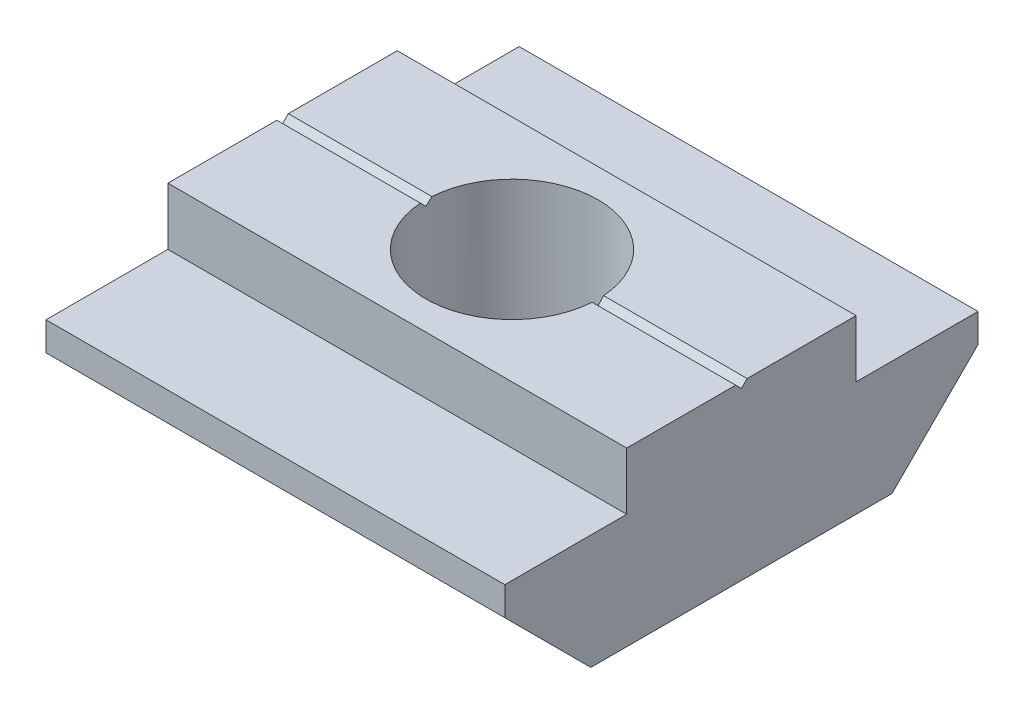
ISO-10303-21;
HEADER;
FILE_DESCRIPTION(('STEP AP214'),'2;1');
FILE_NAME('part.step','',(''),(''),'','','');
FILE_SCHEMA(('AUTOMOTIVE_DESIGN { 1 0 10303 214 1 1 1 1 }'));
ENDSEC;
DATA;
#1=APPLICATION_CONTEXT('core data for automotive mechanical design processes');
#2=APPLICATION_PROTOCOL_DEFINITION('international standard','automotive_design',2000,#1);
#3=PRODUCT_CONTEXT('',#1,'mechanical');
#4=PRODUCT('Part','Part','',(#3));
#5=PRODUCT_RELATED_PRODUCT_CATEGORY('part','',(#4));
#6=PRODUCT_DEFINITION_FORMATION('','',#4);
#7=PRODUCT_DEFINITION_CONTEXT('part definition',#1,'design');
#8=PRODUCT_DEFINITION('design','',#6,#7);
#9=PRODUCT_DEFINITION_SHAPE('','',#8);
#10=(LENGTH_UNIT() NAMED_UNIT(*) SI_UNIT(.MILLI.,.METRE.));
#11=(NAMED_UNIT(*) PLANE_ANGLE_UNIT() SI_UNIT($,.RADIAN.));
#12=(NAMED_UNIT(*) SI_UNIT($,.STERADIAN.) SOLID_ANGLE_UNIT());
#13=UNCERTAINTY_MEASURE_WITH_UNIT(LENGTH_MEASURE(1.E-05),#10,'distance_accuracy_value','');
#14=(GEOMETRIC_REPRESENTATION_CONTEXT(3) GLOBAL_UNCERTAINTY_ASSIGNED_CONTEXT((#13)) GLOBAL_UNIT_ASSIGNED_CONTEXT((#10,
#11,#12)) REPRESENTATION_CONTEXT('',''));
#15=CARTESIAN_POINT('',(0.,0.,0.));
#16=DIRECTION('',(0.,0.,1.));
#17=DIRECTION('',(1.,0.,0.));
#18=AXIS2_PLACEMENT_3D('',#15,#16,#17);
#19=CARTESIAN_POINT('',(-8.,-0.2,0.));
#20=DIRECTION('',(0.,0.707106781186547,-0.707106781186547));
#21=DIRECTION('',(0.,0.707106781186548,0.707106781186548));
#22=AXIS2_PLACEMENT_3D('',#19,#20,#21);
#23=PLANE('',#22);
#24=CARTESIAN_POINT('',(0.,-0.199999999999999,0.));
#25=DIRECTION('',(0.,0.707106781186547,-0.707106781186547));
#26=DIRECTION('',(0.,-0.707106781186548,-0.707106781186548));
#27=AXIS2_PLACEMENT_3D('',#24,#25,#26);
#28=ELLIPSE('',#27,4.24264068711927,2.99999999999999);
#29=CARTESIAN_POINT('',(-2.99999999999999,-0.2,0.));
#30=VERTEX_POINT('',#29);
#31=CARTESIAN_POINT('',(-2.99332590941914,0.,0.2));
#32=VERTEX_POINT('',#31);
#33=EDGE_CURVE('E51',#30,#32,#28,.T.);
#34=ORIENTED_EDGE('',*,*,#33,.F.);
#35=DIRECTION('',(1.,0.,0.));
#36=VECTOR('',#35,1.);
#37=CARTESIAN_POINT('',(-8.,-0.2,0.));
#38=LINE('',#37,#36);
#39=CARTESIAN_POINT('',(-8.,-0.2,0.));
#40=VERTEX_POINT('',#39);
#41=EDGE_CURVE('E42',#40,#30,#38,.T.);
#42=ORIENTED_EDGE('',*,*,#41,.F.);
#43=DIRECTION('',(0.,0.707106781186548,0.707106781186548));
#44=VECTOR('',#43,1.);
#45=CARTESIAN_POINT('',(-8.,-0.2,0.));
#46=LINE('',#45,#44);
#47=CARTESIAN_POINT('',(-8.,0.,0.2));
#48=VERTEX_POINT('',#47);
#49=EDGE_CURVE('E218',#40,#48,#46,.T.);
#50=ORIENTED_EDGE('',*,*,#49,.T.);
#51=DIRECTION('',(1.,0.,0.));
#52=VECTOR('',#51,1.);
#53=CARTESIAN_POINT('',(-8.,0.,0.2));
#54=LINE('',#53,#52);
#55=EDGE_CURVE('E37',#48,#32,#54,.T.);
#56=ORIENTED_EDGE('',*,*,#55,.T.);
#57=EDGE_LOOP('',(#34,#42,#50,#56));
#58=FACE_BOUND('',#57,.T.);
#59=ADVANCED_FACE('F33',(#58),#23,.T.);
#60=CARTESIAN_POINT('',(-8.,0.,-0.2));
#61=DIRECTION('',(0.,0.707106781186548,0.707106781186547));
#62=DIRECTION('',(0.,-0.707106781186547,0.707106781186548));
#63=AXIS2_PLACEMENT_3D('',#60,#61,#62);
#64=PLANE('',#63);
#65=CARTESIAN_POINT('',(0.,-0.2,0.));
#66=DIRECTION('',(0.,0.707106781186548,0.707106781186547));
#67=DIRECTION('',(0.,-0.707106781186547,0.707106781186548));
#68=AXIS2_PLACEMENT_3D('',#65,#66,#67);
#69=ELLIPSE('',#68,4.24264068711927,2.99999999999999);
#70=CARTESIAN_POINT('',(2.99999999999999,-0.2,0.));
#71=VERTEX_POINT('',#70);
#72=CARTESIAN_POINT('',(2.99332590941914,0.,-0.2));
#73=VERTEX_POINT('',#72);
#74=EDGE_CURVE('E251',#71,#73,#69,.T.);
#75=ORIENTED_EDGE('',*,*,#74,.F.);
#76=CARTESIAN_POINT('',(8.,-0.2,0.));
#77=VERTEX_POINT('',#76);
#78=EDGE_CURVE('E107',#71,#77,#38,.T.);
#79=ORIENTED_EDGE('',*,*,#78,.T.);
#80=DIRECTION('',(0.,-0.707106781186547,0.707106781186548));
#81=VECTOR('',#80,1.);
#82=CARTESIAN_POINT('',(8.,0.,-0.2));
#83=LINE('',#82,#81);
#84=CARTESIAN_POINT('',(8.,0.,-0.2));
#85=VERTEX_POINT('',#84);
#86=EDGE_CURVE('E215',#85,#77,#83,.T.);
#87=ORIENTED_EDGE('',*,*,#86,.F.);
#88=DIRECTION('',(1.,0.,0.));
#89=VECTOR('',#88,1.);
#90=CARTESIAN_POINT('',(-8.,0.,-0.2));
#91=LINE('',#90,#89);
#92=EDGE_CURVE('E160',#73,#85,#91,.T.);
#93=ORIENTED_EDGE('',*,*,#92,.F.);
#94=EDGE_LOOP('',(#75,#79,#87,#93));
#95=FACE_BOUND('',#94,.T.);
#96=ADVANCED_FACE('F248',(#95),#64,.T.);
#97=CARTESIAN_POINT('',(-8.,0.,-4.));
#98=DIRECTION('',(0.,1.,0.));
#99=DIRECTION('',(0.,0.,1.));
#100=AXIS2_PLACEMENT_3D('',#97,#98,#99);
#101=PLANE('',#100);
#102=CARTESIAN_POINT('',(-8.,0.,-0.2));
#103=VERTEX_POINT('',#102);
#104=CARTESIAN_POINT('',(-2.99332590941914,0.,-0.2));
#105=VERTEX_POINT('',#104);
#106=EDGE_CURVE('E220',#103,#105,#91,.T.);
#107=ORIENTED_EDGE('',*,*,#106,.T.);
#108=CARTESIAN_POINT('',(0.,0.,0.));
#109=DIRECTION('',(0.,-1.,0.));
#110=DIRECTION('',(0.,0.,-1.));
#111=AXIS2_PLACEMENT_3D('',#108,#109,#110);
#112=CIRCLE('',#111,2.99999999999999);
#113=EDGE_CURVE('E44',#105,#73,#112,.T.);
#114=ORIENTED_EDGE('',*,*,#113,.T.);
#115=ORIENTED_EDGE('',*,*,#92,.T.);
#116=DIRECTION('',(0.,0.,1.));
#117=VECTOR('',#116,1.);
#118=CARTESIAN_POINT('',(8.,0.,-4.));
#119=LINE('',#118,#117);
#120=CARTESIAN_POINT('',(8.,0.,-4.));
#121=VERTEX_POINT('',#120);
#122=EDGE_CURVE('E155',#121,#85,#119,.T.);
#123=ORIENTED_EDGE('',*,*,#122,.F.);
#124=DIRECTION('',(1.,0.,0.));
#125=VECTOR('',#124,1.);
#126=CARTESIAN_POINT('',(-8.,0.,-4.));
#127=LINE('',#126,#125);
#128=CARTESIAN_POINT('',(-8.,0.,-4.));
#129=VERTEX_POINT('',#128);
#130=EDGE_CURVE('E148',#129,#121,#127,.T.);
#131=ORIENTED_EDGE('',*,*,#130,.F.);
#132=DIRECTION('',(0.,0.,1.));
#133=VECTOR('',#132,1.);
#134=CARTESIAN_POINT('',(-8.,0.,-4.));
#135=LINE('',#134,#133);
#136=EDGE_CURVE('E152',#129,#103,#135,.T.);
#137=ORIENTED_EDGE('',*,*,#136,.T.);
#138=EDGE_LOOP('',(#107,#114,#115,#123,#131,#137));
#139=FACE_BOUND('',#138,.T.);
#140=ADVANCED_FACE('F151',(#139),#101,.T.);
#141=CARTESIAN_POINT('',(-8.,0.,0.2));
#142=DIRECTION('',(0.,1.,0.));
#143=DIRECTION('',(0.,0.,1.));
#144=AXIS2_PLACEMENT_3D('',#141,#142,#143);
#145=PLANE('',#144);
#146=CARTESIAN_POINT('',(2.99332590941914,0.,0.2));
#147=VERTEX_POINT('',#146);
#148=CARTESIAN_POINT('',(8.,0.,0.2));
#149=VERTEX_POINT('',#148);
#150=EDGE_CURVE('E180',#147,#149,#54,.T.);
#151=ORIENTED_EDGE('',*,*,#150,.F.);
#152=EDGE_CURVE('E11',#147,#32,#112,.T.);
#153=ORIENTED_EDGE('',*,*,#152,.T.);
#154=ORIENTED_EDGE('',*,*,#55,.F.);
#155=DIRECTION('',(0.,0.,1.));
#156=VECTOR('',#155,1.);
#157=CARTESIAN_POINT('',(-8.,0.,0.2));
#158=LINE('',#157,#156);
#159=CARTESIAN_POINT('',(-8.,0.,4.));
#160=VERTEX_POINT('',#159);
#161=EDGE_CURVE('E265',#48,#160,#158,.T.);
#162=ORIENTED_EDGE('',*,*,#161,.T.);
#163=DIRECTION('',(1.,0.,0.));
#164=VECTOR('',#163,1.);
#165=CARTESIAN_POINT('',(-8.,0.,4.));
#166=LINE('',#165,#164);
#167=CARTESIAN_POINT('',(8.,0.,4.));
#168=VERTEX_POINT('',#167);
#169=EDGE_CURVE('E236',#160,#168,#166,.T.);
#170=ORIENTED_EDGE('',*,*,#169,.T.);
#171=DIRECTION('',(0.,0.,1.));
#172=VECTOR('',#171,1.);
#173=CARTESIAN_POINT('',(8.,0.,0.2));
#174=LINE('',#173,#172);
#175=EDGE_CURVE('E184',#149,#168,#174,.T.);
#176=ORIENTED_EDGE('',*,*,#175,.F.);
#177=EDGE_LOOP('',(#151,#153,#154,#162,#170,#176));
#178=FACE_BOUND('',#177,.T.);
#179=ADVANCED_FACE('F244',(#178),#145,.T.);
#180=EDGE_CURVE('E185',#147,#71,#28,.T.);
#181=ORIENTED_EDGE('',*,*,#180,.F.);
#182=ORIENTED_EDGE('',*,*,#150,.T.);
#183=DIRECTION('',(0.,0.707106781186548,0.707106781186548));
#184=VECTOR('',#183,1.);
#185=CARTESIAN_POINT('',(8.,-0.2,0.));
#186=LINE('',#185,#184);
#187=EDGE_CURVE('E181',#77,#149,#186,.T.);
#188=ORIENTED_EDGE('',*,*,#187,.F.);
#189=ORIENTED_EDGE('',*,*,#78,.F.);
#190=EDGE_LOOP('',(#181,#182,#188,#189));
#191=FACE_BOUND('',#190,.T.);
#192=ADVANCED_FACE('F35',(#191),#23,.T.);
#193=EDGE_CURVE('E257',#105,#30,#69,.T.);
#194=ORIENTED_EDGE('',*,*,#193,.F.);
#195=ORIENTED_EDGE('',*,*,#106,.F.);
#196=DIRECTION('',(0.,-0.707106781186547,0.707106781186548));
#197=VECTOR('',#196,1.);
#198=CARTESIAN_POINT('',(-8.,0.,-0.2));
#199=LINE('',#198,#197);
#200=EDGE_CURVE('E170',#103,#40,#199,.T.);
#201=ORIENTED_EDGE('',*,*,#200,.T.);
#202=ORIENTED_EDGE('',*,*,#41,.T.);
#203=EDGE_LOOP('',(#194,#195,#201,#202));
#204=FACE_BOUND('',#203,.T.);
#205=ADVANCED_FACE('F319',(#204),#64,.T.);
#206=CARTESIAN_POINT('',(-8.,-2.,-4.));
#207=DIRECTION('',(0.,0.,-1.));
#208=DIRECTION('',(-1.,0.,0.));
#209=AXIS2_PLACEMENT_3D('',#206,#207,#208);
#210=PLANE('',#209);
#211=DIRECTION('',(0.,1.,0.));
#212=VECTOR('',#211,1.);
#213=CARTESIAN_POINT('',(8.,-2.,-4.));
#214=LINE('',#213,#212);
#215=CARTESIAN_POINT('',(8.,-2.,-4.));
#216=VERTEX_POINT('',#215);
#217=EDGE_CURVE('E212',#216,#121,#214,.T.);
#218=ORIENTED_EDGE('',*,*,#217,.F.);
#219=DIRECTION('',(1.,0.,0.));
#220=VECTOR('',#219,1.);
#221=CARTESIAN_POINT('',(-8.,-2.,-4.));
#222=LINE('',#221,#220);
#223=CARTESIAN_POINT('',(-8.,-2.,-4.));
#224=VERTEX_POINT('',#223);
#225=EDGE_CURVE('E161',#224,#216,#222,.T.);
#226=ORIENTED_EDGE('',*,*,#225,.F.);
#227=DIRECTION('',(0.,1.,0.));
#228=VECTOR('',#227,1.);
#229=CARTESIAN_POINT('',(-8.,-2.,-4.));
#230=LINE('',#229,#228);
#231=EDGE_CURVE('E167',#224,#129,#230,.T.);
#232=ORIENTED_EDGE('',*,*,#231,.T.);
#233=ORIENTED_EDGE('',*,*,#130,.T.);
#234=EDGE_LOOP('',(#218,#226,#232,#233));
#235=FACE_BOUND('',#234,.T.);
#236=ADVANCED_FACE('F172',(#235),#210,.T.);
#237=CARTESIAN_POINT('',(-8.,-2.,-8.25));
#238=DIRECTION('',(0.,1.,0.));
#239=DIRECTION('',(0.,0.,1.));
#240=AXIS2_PLACEMENT_3D('',#237,#238,#239);
#241=PLANE('',#240);
#242=DIRECTION('',(0.,0.,1.));
#243=VECTOR('',#242,1.);
#244=CARTESIAN_POINT('',(8.,-2.,-8.25));
#245=LINE('',#244,#243);
#246=CARTESIAN_POINT('',(8.,-2.,-8.25));
#247=VERTEX_POINT('',#246);
#248=EDGE_CURVE('E209',#247,#216,#245,.T.);
#249=ORIENTED_EDGE('',*,*,#248,.F.);
#250=DIRECTION('',(1.,0.,0.));
#251=VECTOR('',#250,1.);
#252=CARTESIAN_POINT('',(-8.,-2.,-8.25));
#253=LINE('',#252,#251);
#254=CARTESIAN_POINT('',(-8.,-2.,-8.25));
#255=VERTEX_POINT('',#254);
#256=EDGE_CURVE('E223',#255,#247,#253,.T.);
#257=ORIENTED_EDGE('',*,*,#256,.F.);
#258=DIRECTION('',(0.,0.,1.));
#259=VECTOR('',#258,1.);
#260=CARTESIAN_POINT('',(-8.,-2.,-8.25));
#261=LINE('',#260,#259);
#262=EDGE_CURVE('E173',#255,#224,#261,.T.);
#263=ORIENTED_EDGE('',*,*,#262,.T.);
#264=ORIENTED_EDGE('',*,*,#225,.T.);
#265=EDGE_LOOP('',(#249,#257,#263,#264));
#266=FACE_BOUND('',#265,.T.);
#267=ADVANCED_FACE('F346',(#266),#241,.T.);
#268=CARTESIAN_POINT('',(-8.,-3.,-8.25));
#269=DIRECTION('',(0.,0.,-1.));
#270=DIRECTION('',(-1.,0.,0.));
#271=AXIS2_PLACEMENT_3D('',#268,#269,#270);
#272=PLANE('',#271);
#273=DIRECTION('',(0.,1.,0.));
#274=VECTOR('',#273,1.);
#275=CARTESIAN_POINT('',(8.,-3.,-8.25));
#276=LINE('',#275,#274);
#277=CARTESIAN_POINT('',(8.,-3.,-8.25));
#278=VERTEX_POINT('',#277);
#279=EDGE_CURVE('E206',#278,#247,#276,.T.);
#280=ORIENTED_EDGE('',*,*,#279,.F.);
#281=DIRECTION('',(1.,0.,0.));
#282=VECTOR('',#281,1.);
#283=CARTESIAN_POINT('',(-8.,-3.,-8.25));
#284=LINE('',#283,#282);
#285=CARTESIAN_POINT('',(-8.,-3.,-8.25));
#286=VERTEX_POINT('',#285);
#287=EDGE_CURVE('E225',#286,#278,#284,.T.);
#288=ORIENTED_EDGE('',*,*,#287,.F.);
#289=DIRECTION('',(0.,1.,0.));
#290=VECTOR('',#289,1.);
#291=CARTESIAN_POINT('',(-8.,-3.,-8.25));
#292=LINE('',#291,#290);
#293=EDGE_CURVE('E175',#286,#255,#292,.T.);
#294=ORIENTED_EDGE('',*,*,#293,.T.);
#295=ORIENTED_EDGE('',*,*,#256,.T.);
#296=EDGE_LOOP('',(#280,#288,#294,#295));
#297=FACE_BOUND('',#296,.T.);
#298=ADVANCED_FACE('F288',(#297),#272,.T.);
#299=CARTESIAN_POINT('',(-8.,-6.,-5.25));
#300=DIRECTION('',(0.,-0.707106781186548,-0.707106781186547));
#301=DIRECTION('',(0.,0.707106781186547,-0.707106781186548));
#302=AXIS2_PLACEMENT_3D('',#299,#300,#301);
#303=PLANE('',#302);
#304=DIRECTION('',(0.,0.707106781186547,-0.707106781186548));
#305=VECTOR('',#304,1.);
#306=CARTESIAN_POINT('',(8.,-6.,-5.25));
#307=LINE('',#306,#305);
#308=CARTESIAN_POINT('',(8.,-6.,-5.25));
#309=VERTEX_POINT('',#308);
#310=EDGE_CURVE('E203',#309,#278,#307,.T.);
#311=ORIENTED_EDGE('',*,*,#310,.F.);
#312=DIRECTION('',(1.,0.,0.));
#313=VECTOR('',#312,1.);
#314=CARTESIAN_POINT('',(-8.,-6.,-5.25));
#315=LINE('',#314,#313);
#316=CARTESIAN_POINT('',(-8.,-6.,-5.25));
#317=VERTEX_POINT('',#316);
#318=EDGE_CURVE('E227',#317,#309,#315,.T.);
#319=ORIENTED_EDGE('',*,*,#318,.F.);
#320=DIRECTION('',(0.,0.707106781186547,-0.707106781186548));
#321=VECTOR('',#320,1.);
#322=CARTESIAN_POINT('',(-8.,-6.,-5.25));
#323=LINE('',#322,#321);
#324=EDGE_CURVE('E282',#317,#286,#323,.T.);
#325=ORIENTED_EDGE('',*,*,#324,.T.);
#326=ORIENTED_EDGE('',*,*,#287,.T.);
#327=EDGE_LOOP('',(#311,#319,#325,#326));
#328=FACE_BOUND('',#327,.T.);
#329=ADVANCED_FACE('F294',(#328),#303,.T.);
#330=CARTESIAN_POINT('',(-8.,-6.,5.25));
#331=DIRECTION('',(0.,-1.,0.));
#332=DIRECTION('',(0.,0.,-1.));
#333=AXIS2_PLACEMENT_3D('',#330,#331,#332);
#334=PLANE('',#333);
#335=CARTESIAN_POINT('',(0.,-6.,0.));
#336=DIRECTION('',(0.,-1.,0.));
#337=DIRECTION('',(0.,0.,-1.));
#338=AXIS2_PLACEMENT_3D('',#335,#336,#337);
#339=CIRCLE('',#338,2.99999999999999);
#340=CARTESIAN_POINT('',(0.,-6.,-2.99999999999999));
#341=VERTEX_POINT('',#340);
#342=EDGE_CURVE('E258',#341,#341,#339,.T.);
#343=ORIENTED_EDGE('',*,*,#342,.F.);
#344=EDGE_LOOP('',(#343));
#345=FACE_BOUND('',#344,.T.);
#346=DIRECTION('',(0.,0.,-1.));
#347=VECTOR('',#346,1.);
#348=CARTESIAN_POINT('',(8.,-6.,5.25));
#349=LINE('',#348,#347);
#350=CARTESIAN_POINT('',(8.,-6.,5.25));
#351=VERTEX_POINT('',#350);
#352=EDGE_CURVE('E200',#351,#309,#349,.T.);
#353=ORIENTED_EDGE('',*,*,#352,.F.);
#354=DIRECTION('',(1.,0.,0.));
#355=VECTOR('',#354,1.);
#356=CARTESIAN_POINT('',(-8.,-6.,5.25));
#357=LINE('',#356,#355);
#358=CARTESIAN_POINT('',(-8.,-6.,5.25));
#359=VERTEX_POINT('',#358);
#360=EDGE_CURVE('E229',#359,#351,#357,.T.);
#361=ORIENTED_EDGE('',*,*,#360,.F.);
#362=DIRECTION('',(0.,0.,-1.));
#363=VECTOR('',#362,1.);
#364=CARTESIAN_POINT('',(-8.,-6.,5.25));
#365=LINE('',#364,#363);
#366=EDGE_CURVE('E279',#359,#317,#365,.T.);
#367=ORIENTED_EDGE('',*,*,#366,.T.);
#368=ORIENTED_EDGE('',*,*,#318,.T.);
#369=EDGE_LOOP('',(#353,#361,#367,#368));
#370=FACE_BOUND('',#369,.T.);
#371=ADVANCED_FACE('F297',(#345,#370),#334,.T.);
#372=CARTESIAN_POINT('',(-8.,-3.,8.25));
#373=DIRECTION('',(0.,-0.707106781186547,0.707106781186547));
#374=DIRECTION('',(0.,-0.707106781186548,-0.707106781186548));
#375=AXIS2_PLACEMENT_3D('',#372,#373,#374);
#376=PLANE('',#375);
#377=DIRECTION('',(0.,-0.707106781186547,-0.707106781186547));
#378=VECTOR('',#377,1.);
#379=CARTESIAN_POINT('',(8.,-3.,8.25));
#380=LINE('',#379,#378);
#381=CARTESIAN_POINT('',(8.,-3.,8.25));
#382=VERTEX_POINT('',#381);
#383=EDGE_CURVE('E197',#382,#351,#380,.T.);
#384=ORIENTED_EDGE('',*,*,#383,.F.);
#385=DIRECTION('',(1.,0.,0.));
#386=VECTOR('',#385,1.);
#387=CARTESIAN_POINT('',(-8.,-3.,8.25));
#388=LINE('',#387,#386);
#389=CARTESIAN_POINT('',(-8.,-3.,8.25));
#390=VERTEX_POINT('',#389);
#391=EDGE_CURVE('E231',#390,#382,#388,.T.);
#392=ORIENTED_EDGE('',*,*,#391,.F.);
#393=DIRECTION('',(0.,-0.707106781186547,-0.707106781186547));
#394=VECTOR('',#393,1.);
#395=CARTESIAN_POINT('',(-8.,-3.,8.25));
#396=LINE('',#395,#394);
#397=EDGE_CURVE('E276',#390,#359,#396,.T.);
#398=ORIENTED_EDGE('',*,*,#397,.T.);
#399=ORIENTED_EDGE('',*,*,#360,.T.);
#400=EDGE_LOOP('',(#384,#392,#398,#399));
#401=FACE_BOUND('',#400,.T.);
#402=ADVANCED_FACE('F302',(#401),#376,.T.);
#403=CARTESIAN_POINT('',(-8.,-2.,8.25));
#404=DIRECTION('',(0.,0.,1.));
#405=DIRECTION('',(1.,0.,0.));
#406=AXIS2_PLACEMENT_3D('',#403,#404,#405);
#407=PLANE('',#406);
#408=DIRECTION('',(0.,-1.,0.));
#409=VECTOR('',#408,1.);
#410=CARTESIAN_POINT('',(8.,-2.,8.25));
#411=LINE('',#410,#409);
#412=CARTESIAN_POINT('',(8.,-2.,8.25));
#413=VERTEX_POINT('',#412);
#414=EDGE_CURVE('E194',#413,#382,#411,.T.);
#415=ORIENTED_EDGE('',*,*,#414,.F.);
#416=DIRECTION('',(1.,0.,0.));
#417=VECTOR('',#416,1.);
#418=CARTESIAN_POINT('',(-8.,-2.,8.25));
#419=LINE('',#418,#417);
#420=CARTESIAN_POINT('',(-8.,-2.,8.25));
#421=VERTEX_POINT('',#420);
#422=EDGE_CURVE('E233',#421,#413,#419,.T.);
#423=ORIENTED_EDGE('',*,*,#422,.F.);
#424=DIRECTION('',(0.,-1.,0.));
#425=VECTOR('',#424,1.);
#426=CARTESIAN_POINT('',(-8.,-2.,8.25));
#427=LINE('',#426,#425);
#428=EDGE_CURVE('E273',#421,#390,#427,.T.);
#429=ORIENTED_EDGE('',*,*,#428,.T.);
#430=ORIENTED_EDGE('',*,*,#391,.T.);
#431=EDGE_LOOP('',(#415,#423,#429,#430));
#432=FACE_BOUND('',#431,.T.);
#433=ADVANCED_FACE('F305',(#432),#407,.T.);
#434=CARTESIAN_POINT('',(-8.,-2.,4.));
#435=DIRECTION('',(0.,1.,0.));
#436=DIRECTION('',(0.,0.,1.));
#437=AXIS2_PLACEMENT_3D('',#434,#435,#436);
#438=PLANE('',#437);
#439=DIRECTION('',(0.,0.,1.));
#440=VECTOR('',#439,1.);
#441=CARTESIAN_POINT('',(8.,-2.,4.));
#442=LINE('',#441,#440);
#443=CARTESIAN_POINT('',(8.,-2.,4.));
#444=VERTEX_POINT('',#443);
#445=EDGE_CURVE('E191',#444,#413,#442,.T.);
#446=ORIENTED_EDGE('',*,*,#445,.F.);
#447=DIRECTION('',(1.,0.,0.));
#448=VECTOR('',#447,1.);
#449=CARTESIAN_POINT('',(-8.,-2.,4.));
#450=LINE('',#449,#448);
#451=CARTESIAN_POINT('',(-8.,-2.,4.));
#452=VERTEX_POINT('',#451);
#453=EDGE_CURVE('E235',#452,#444,#450,.T.);
#454=ORIENTED_EDGE('',*,*,#453,.F.);
#455=DIRECTION('',(0.,0.,1.));
#456=VECTOR('',#455,1.);
#457=CARTESIAN_POINT('',(-8.,-2.,4.));
#458=LINE('',#457,#456);
#459=EDGE_CURVE('E270',#452,#421,#458,.T.);
#460=ORIENTED_EDGE('',*,*,#459,.T.);
#461=ORIENTED_EDGE('',*,*,#422,.T.);
#462=EDGE_LOOP('',(#446,#454,#460,#461));
#463=FACE_BOUND('',#462,.T.);
#464=ADVANCED_FACE('F310',(#463),#438,.T.);
#465=CARTESIAN_POINT('',(-8.,0.,4.));
#466=DIRECTION('',(0.,0.,1.));
#467=DIRECTION('',(1.,0.,0.));
#468=AXIS2_PLACEMENT_3D('',#465,#466,#467);
#469=PLANE('',#468);
#470=DIRECTION('',(0.,-1.,0.));
#471=VECTOR('',#470,1.);
#472=CARTESIAN_POINT('',(8.,0.,4.));
#473=LINE('',#472,#471);
#474=EDGE_CURVE('E188',#168,#444,#473,.T.);
#475=ORIENTED_EDGE('',*,*,#474,.F.);
#476=ORIENTED_EDGE('',*,*,#169,.F.);
#477=DIRECTION('',(0.,-1.,0.));
#478=VECTOR('',#477,1.);
#479=CARTESIAN_POINT('',(-8.,0.,4.));
#480=LINE('',#479,#478);
#481=EDGE_CURVE('E267',#160,#452,#480,.T.);
#482=ORIENTED_EDGE('',*,*,#481,.T.);
#483=ORIENTED_EDGE('',*,*,#453,.T.);
#484=EDGE_LOOP('',(#475,#476,#482,#483));
#485=FACE_BOUND('',#484,.T.);
#486=ADVANCED_FACE('F312',(#485),#469,.T.);
#487=CARTESIAN_POINT('',(-8.,-5.725,-5.525));
#488=DIRECTION('',(-1.,0.,0.));
#489=DIRECTION('',(0.,0.,1.));
#490=AXIS2_PLACEMENT_3D('',#487,#488,#489);
#491=PLANE('',#490);
#492=ORIENTED_EDGE('',*,*,#49,.F.);
#493=ORIENTED_EDGE('',*,*,#200,.F.);
#494=ORIENTED_EDGE('',*,*,#136,.F.);
#495=ORIENTED_EDGE('',*,*,#231,.F.);
#496=ORIENTED_EDGE('',*,*,#262,.F.);
#497=ORIENTED_EDGE('',*,*,#293,.F.);
#498=ORIENTED_EDGE('',*,*,#324,.F.);
#499=ORIENTED_EDGE('',*,*,#366,.F.);
#500=ORIENTED_EDGE('',*,*,#397,.F.);
#501=ORIENTED_EDGE('',*,*,#428,.F.);
#502=ORIENTED_EDGE('',*,*,#459,.F.);
#503=ORIENTED_EDGE('',*,*,#481,.F.);
#504=ORIENTED_EDGE('',*,*,#161,.F.);
#505=EDGE_LOOP('',(#492,#493,#494,#495,#496,#497,#498,#499,#500,#501,#502,#503,#504));
#506=FACE_BOUND('',#505,.T.);
#507=ADVANCED_FACE('F165',(#506),#491,.T.);
#508=CARTESIAN_POINT('',(8.,-5.725,-5.525));
#509=DIRECTION('',(-1.,0.,0.));
#510=DIRECTION('',(0.,0.,1.));
#511=AXIS2_PLACEMENT_3D('',#508,#509,#510);
#512=PLANE('',#511);
#513=ORIENTED_EDGE('',*,*,#187,.T.);
#514=ORIENTED_EDGE('',*,*,#175,.T.);
#515=ORIENTED_EDGE('',*,*,#474,.T.);
#516=ORIENTED_EDGE('',*,*,#445,.T.);
#517=ORIENTED_EDGE('',*,*,#414,.T.);
#518=ORIENTED_EDGE('',*,*,#383,.T.);
#519=ORIENTED_EDGE('',*,*,#352,.T.);
#520=ORIENTED_EDGE('',*,*,#310,.T.);
#521=ORIENTED_EDGE('',*,*,#279,.T.);
#522=ORIENTED_EDGE('',*,*,#248,.T.);
#523=ORIENTED_EDGE('',*,*,#217,.T.);
#524=ORIENTED_EDGE('',*,*,#122,.T.);
#525=ORIENTED_EDGE('',*,*,#86,.T.);
#526=EDGE_LOOP('',(#513,#514,#515,#516,#517,#518,#519,#520,#521,#522,#523,#524,#525));
#527=FACE_BOUND('',#526,.T.);
#528=ADVANCED_FACE('F246',(#527),#512,.F.);
#529=CARTESIAN_POINT('',(0.,-6.,0.));
#530=DIRECTION('',(0.,-1.,0.));
#531=DIRECTION('',(0.,0.,-1.));
#532=AXIS2_PLACEMENT_3D('',#529,#530,#531);
#533=CYLINDRICAL_SURFACE('',#532,2.99999999999999);
#534=ORIENTED_EDGE('',*,*,#180,.T.);
#535=ORIENTED_EDGE('',*,*,#74,.T.);
#536=ORIENTED_EDGE('',*,*,#113,.F.);
#537=ORIENTED_EDGE('',*,*,#193,.T.);
#538=ORIENTED_EDGE('',*,*,#33,.T.);
#539=ORIENTED_EDGE('',*,*,#152,.F.);
#540=EDGE_LOOP('',(#534,#535,#536,#537,#538,#539));
#541=FACE_BOUND('',#540,.T.);
#542=ORIENTED_EDGE('',*,*,#342,.T.);
#543=EDGE_LOOP('',(#542));
#544=FACE_BOUND('',#543,.T.);
#545=ADVANCED_FACE('F354',(#541,#544),#533,.F.);
#546=CLOSED_SHELL('',(#59,#96,#140,#179,#192,#205,#236,#267,#298,#329,#371,#402,#433,#464,#486,
#507,#528,#545));
#547=MANIFOLD_SOLID_BREP('B2',#546);
#548=ADVANCED_BREP_SHAPE_REPRESENTATION('',(#18,#547),#14);
#549=SHAPE_DEFINITION_REPRESENTATION(#9,#548);
ENDSEC;
END-ISO-10303-21;
